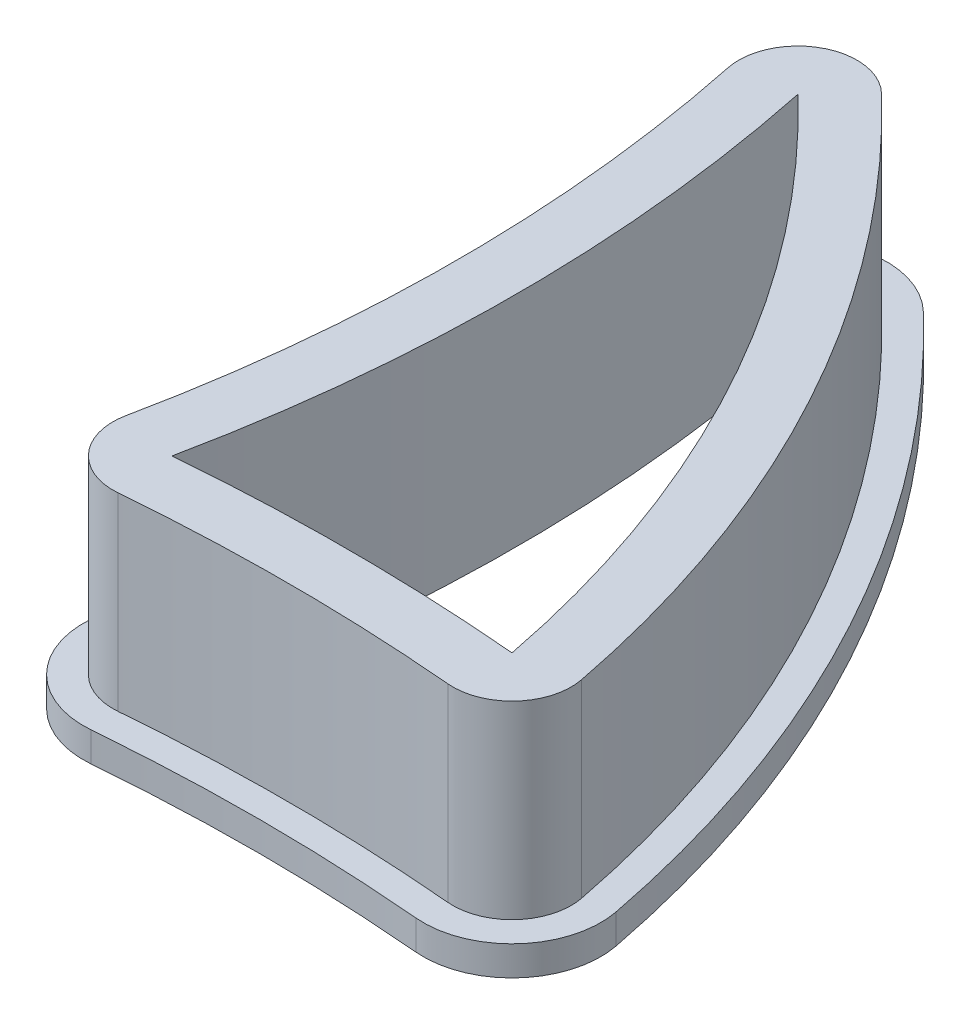
ISO-10303-21;
HEADER;
FILE_DESCRIPTION(('STEP AP214'),'2;1');
FILE_NAME('part.step','',(''),(''),'','','');
FILE_SCHEMA(('AUTOMOTIVE_DESIGN { 1 0 10303 214 1 1 1 1 }'));
ENDSEC;
DATA;
#1=APPLICATION_CONTEXT('core data for automotive mechanical design processes');
#2=APPLICATION_PROTOCOL_DEFINITION('international standard','automotive_design',2000,#1);
#3=PRODUCT_CONTEXT('',#1,'mechanical');
#4=PRODUCT('Part','Part','',(#3));
#5=PRODUCT_RELATED_PRODUCT_CATEGORY('part','',(#4));
#6=PRODUCT_DEFINITION_FORMATION('','',#4);
#7=PRODUCT_DEFINITION_CONTEXT('part definition',#1,'design');
#8=PRODUCT_DEFINITION('design','',#6,#7);
#9=PRODUCT_DEFINITION_SHAPE('','',#8);
#10=(LENGTH_UNIT() NAMED_UNIT(*) SI_UNIT(.MILLI.,.METRE.));
#11=(NAMED_UNIT(*) PLANE_ANGLE_UNIT() SI_UNIT($,.RADIAN.));
#12=(NAMED_UNIT(*) SI_UNIT($,.STERADIAN.) SOLID_ANGLE_UNIT());
#13=UNCERTAINTY_MEASURE_WITH_UNIT(LENGTH_MEASURE(1.E-05),#10,'distance_accuracy_value','');
#14=(GEOMETRIC_REPRESENTATION_CONTEXT(3) GLOBAL_UNCERTAINTY_ASSIGNED_CONTEXT((#13)) GLOBAL_UNIT_ASSIGNED_CONTEXT((#10,
#11,#12)) REPRESENTATION_CONTEXT('',''));
#15=CARTESIAN_POINT('',(0.,0.,0.));
#16=DIRECTION('',(0.,0.,1.));
#17=DIRECTION('',(1.,0.,0.));
#18=AXIS2_PLACEMENT_3D('',#15,#16,#17);
#19=CARTESIAN_POINT('',(-16.7034426225577,6.4,28.0001131602208));
#20=DIRECTION('',(0.,-1.,0.));
#21=DIRECTION('',(0.,0.,-1.));
#22=AXIS2_PLACEMENT_3D('',#19,#20,#21);
#23=PLANE('',#22);
#24=CARTESIAN_POINT('',(-56.570297770506,6.4,-19.7668709331461));
#25=DIRECTION('',(0.,-1.,0.));
#26=DIRECTION('',(0.,0.,-1.));
#27=AXIS2_PLACEMENT_3D('',#24,#25,#26);
#28=CIRCLE('',#27,50.);
#29=CARTESIAN_POINT('',(-7.6214221967614,6.4,-29.9652815968757));
#30=VERTEX_POINT('',#29);
#31=CARTESIAN_POINT('',(-7.61303510442141,6.4,-9.60879866307428));
#32=VERTEX_POINT('',#31);
#33=EDGE_CURVE('E245',#30,#32,#28,.T.);
#34=ORIENTED_EDGE('',*,*,#33,.T.);
#35=CARTESIAN_POINT('',(-5.65474459777802,6.4,-9.20247577227141));
#36=DIRECTION('',(0.,-1.,0.));
#37=DIRECTION('',(0.,0.,-1.));
#38=AXIS2_PLACEMENT_3D('',#35,#36,#37);
#39=CIRCLE('',#38,2.);
#40=CARTESIAN_POINT('',(-5.48594625157569,6.4,-7.20961172314027));
#41=VERTEX_POINT('',#40);
#42=EDGE_CURVE('E277',#32,#41,#39,.F.);
#43=ORIENTED_EDGE('',*,*,#42,.T.);
#44=CARTESIAN_POINT('',(0.,6.4,57.5584698736217));
#45=DIRECTION('',(0.,-1.,0.));
#46=DIRECTION('',(0.,0.,-1.));
#47=AXIS2_PLACEMENT_3D('',#44,#45,#46);
#48=CIRCLE('',#47,65.);
#49=CARTESIAN_POINT('',(5.68441833818465,6.4,-7.19249450650553));
#50=VERTEX_POINT('',#49);
#51=EDGE_CURVE('E231',#41,#50,#48,.T.);
#52=ORIENTED_EDGE('',*,*,#51,.T.);
#53=CARTESIAN_POINT('',(5.8593235178211,6.4,-9.18483187204791));
#54=DIRECTION('',(0.,-1.,0.));
#55=DIRECTION('',(0.,0.,-1.));
#56=AXIS2_PLACEMENT_3D('',#53,#54,#55);
#57=CIRCLE('',#56,2.);
#58=CARTESIAN_POINT('',(7.82263395596792,6.4,-9.5661612879913));
#59=VERTEX_POINT('',#58);
#60=EDGE_CURVE('E271',#50,#59,#57,.F.);
#61=ORIENTED_EDGE('',*,*,#60,.T.);
#62=CARTESIAN_POINT('',(-33.4068852451154,6.4,-1.55824355318018));
#63=DIRECTION('',(0.,1.,0.));
#64=DIRECTION('',(0.,0.,1.));
#65=AXIS2_PLACEMENT_3D('',#62,#63,#64);
#66=CIRCLE('',#65,42.);
#67=CARTESIAN_POINT('',(-4.27629627024642,6.4,-31.8139667469371));
#68=VERTEX_POINT('',#67);
#69=EDGE_CURVE('E240',#59,#68,#66,.T.);
#70=ORIENTED_EDGE('',*,*,#69,.T.);
#71=CARTESIAN_POINT('',(-5.66346717381161,6.4,-30.3732180234249));
#72=DIRECTION('',(0.,-1.,0.));
#73=DIRECTION('',(0.,0.,-1.));
#74=AXIS2_PLACEMENT_3D('',#71,#72,#73);
#75=CIRCLE('',#74,2.);
#76=EDGE_CURVE('E268',#68,#30,#75,.F.);
#77=ORIENTED_EDGE('',*,*,#76,.T.);
#78=EDGE_LOOP('',(#34,#43,#52,#61,#70,#77));
#79=FACE_BOUND('',#78,.T.);
#80=CARTESIAN_POINT('',(0.,6.4,57.5584698736217));
#81=DIRECTION('',(0.,-1.,0.));
#82=DIRECTION('',(0.,0.,-1.));
#83=AXIS2_PLACEMENT_3D('',#80,#81,#82);
#84=CIRCLE('',#83,67.);
#85=CARTESIAN_POINT('',(-5.65474459777802,6.4,-9.20247577227142));
#86=VERTEX_POINT('',#85);
#87=CARTESIAN_POINT('',(5.8593235178211,6.4,-9.1848318720479));
#88=VERTEX_POINT('',#87);
#89=EDGE_CURVE('E177',#86,#88,#84,.T.);
#90=ORIENTED_EDGE('',*,*,#89,.F.);
#91=CARTESIAN_POINT('',(-56.570297770506,6.4,-19.7668709331461));
#92=DIRECTION('',(0.,-1.,0.));
#93=DIRECTION('',(0.,0.,-1.));
#94=AXIS2_PLACEMENT_3D('',#91,#92,#93);
#95=CIRCLE('',#94,52.);
#96=CARTESIAN_POINT('',(-5.66346717381161,6.4,-30.3732180234249));
#97=VERTEX_POINT('',#96);
#98=EDGE_CURVE('E223',#97,#86,#95,.T.);
#99=ORIENTED_EDGE('',*,*,#98,.F.);
#100=CARTESIAN_POINT('',(-33.4068852451154,6.4,-1.55824355318018));
#101=DIRECTION('',(0.,1.,0.));
#102=DIRECTION('',(0.,0.,1.));
#103=AXIS2_PLACEMENT_3D('',#100,#101,#102);
#104=CIRCLE('',#103,40.);
#105=EDGE_CURVE('E225',#88,#97,#104,.T.);
#106=ORIENTED_EDGE('',*,*,#105,.F.);
#107=EDGE_LOOP('',(#90,#99,#106));
#108=FACE_BOUND('',#107,.T.);
#109=ADVANCED_FACE('F65',(#79,#108),#23,.F.);
#110=CARTESIAN_POINT('',(0.,6.4,57.5584698736217));
#111=DIRECTION('',(0.,-1.,0.));
#112=DIRECTION('',(0.,0.,-1.));
#113=AXIS2_PLACEMENT_3D('',#110,#111,#112);
#114=CYLINDRICAL_SURFACE('',#113,65.);
#115=ORIENTED_EDGE('',*,*,#51,.F.);
#116=DIRECTION('',(0.,-1.,0.));
#117=VECTOR('',#116,1.);
#118=CARTESIAN_POINT('',(-5.48594625157569,6.4,-7.20961172314029));
#119=LINE('',#118,#117);
#120=CARTESIAN_POINT('',(-5.48594625157569,0.,-7.20961172314027));
#121=VERTEX_POINT('',#120);
#122=EDGE_CURVE('E256',#41,#121,#119,.T.);
#123=ORIENTED_EDGE('',*,*,#122,.T.);
#124=CARTESIAN_POINT('',(0.,0.,57.5584698736217));
#125=DIRECTION('',(0.,-1.,0.));
#126=DIRECTION('',(0.,0.,-1.));
#127=AXIS2_PLACEMENT_3D('',#124,#125,#126);
#128=CIRCLE('',#127,65.);
#129=CARTESIAN_POINT('',(5.68441833818465,0.,-7.19249450650553));
#130=VERTEX_POINT('',#129);
#131=EDGE_CURVE('E185',#121,#130,#128,.T.);
#132=ORIENTED_EDGE('',*,*,#131,.T.);
#133=DIRECTION('',(0.,-1.,0.));
#134=VECTOR('',#133,1.);
#135=CARTESIAN_POINT('',(5.68441833818465,6.4,-7.19249450650553));
#136=LINE('',#135,#134);
#137=EDGE_CURVE('E246',#130,#50,#136,.F.);
#138=ORIENTED_EDGE('',*,*,#137,.T.);
#139=EDGE_LOOP('',(#115,#123,#132,#138));
#140=FACE_BOUND('',#139,.T.);
#141=ADVANCED_FACE('F356',(#140),#114,.F.);
#142=CARTESIAN_POINT('',(-33.4068852451154,6.4,-1.55824355318018));
#143=DIRECTION('',(0.,-1.,0.));
#144=DIRECTION('',(0.,0.,-1.));
#145=AXIS2_PLACEMENT_3D('',#142,#143,#144);
#146=CYLINDRICAL_SURFACE('',#145,42.);
#147=ORIENTED_EDGE('',*,*,#69,.F.);
#148=DIRECTION('',(0.,-1.,0.));
#149=VECTOR('',#148,1.);
#150=CARTESIAN_POINT('',(7.82263395596792,6.4,-9.5661612879913));
#151=LINE('',#150,#149);
#152=CARTESIAN_POINT('',(7.82263395596792,0.,-9.5661612879913));
#153=VERTEX_POINT('',#152);
#154=EDGE_CURVE('E285',#59,#153,#151,.T.);
#155=ORIENTED_EDGE('',*,*,#154,.T.);
#156=CARTESIAN_POINT('',(-33.4068852451154,0.,-1.55824355318018));
#157=DIRECTION('',(0.,1.,0.));
#158=DIRECTION('',(0.,0.,1.));
#159=AXIS2_PLACEMENT_3D('',#156,#157,#158);
#160=CIRCLE('',#159,42.);
#161=CARTESIAN_POINT('',(-4.27629627024642,0.,-31.8139667469371));
#162=VERTEX_POINT('',#161);
#163=EDGE_CURVE('E249',#153,#162,#160,.T.);
#164=ORIENTED_EDGE('',*,*,#163,.T.);
#165=DIRECTION('',(0.,-1.,0.));
#166=VECTOR('',#165,1.);
#167=CARTESIAN_POINT('',(-4.27629627024642,6.4,-31.8139667469371));
#168=LINE('',#167,#166);
#169=EDGE_CURVE('E276',#162,#68,#168,.F.);
#170=ORIENTED_EDGE('',*,*,#169,.T.);
#171=EDGE_LOOP('',(#147,#155,#164,#170));
#172=FACE_BOUND('',#171,.T.);
#173=ADVANCED_FACE('F364',(#172),#146,.T.);
#174=CARTESIAN_POINT('',(-56.570297770506,6.4,-19.7668709331461));
#175=DIRECTION('',(0.,-1.,0.));
#176=DIRECTION('',(0.,0.,-1.));
#177=AXIS2_PLACEMENT_3D('',#174,#175,#176);
#178=CYLINDRICAL_SURFACE('',#177,50.);
#179=CARTESIAN_POINT('',(-56.570297770506,0.,-19.7668709331461));
#180=DIRECTION('',(0.,-1.,0.));
#181=DIRECTION('',(0.,0.,-1.));
#182=AXIS2_PLACEMENT_3D('',#179,#180,#181);
#183=CIRCLE('',#182,50.);
#184=CARTESIAN_POINT('',(-7.6214221967614,0.,-29.9652815968757));
#185=VERTEX_POINT('',#184);
#186=CARTESIAN_POINT('',(-7.61303510442141,0.,-9.60879866307428));
#187=VERTEX_POINT('',#186);
#188=EDGE_CURVE('E238',#185,#187,#183,.T.);
#189=ORIENTED_EDGE('',*,*,#188,.T.);
#190=DIRECTION('',(0.,-1.,0.));
#191=VECTOR('',#190,1.);
#192=CARTESIAN_POINT('',(-7.61303510442139,6.4,-9.60879866307428));
#193=LINE('',#192,#191);
#194=EDGE_CURVE('E270',#187,#32,#193,.F.);
#195=ORIENTED_EDGE('',*,*,#194,.T.);
#196=ORIENTED_EDGE('',*,*,#33,.F.);
#197=DIRECTION('',(0.,-1.,0.));
#198=VECTOR('',#197,1.);
#199=CARTESIAN_POINT('',(-7.62142219676139,6.4,-29.9652815968757));
#200=LINE('',#199,#198);
#201=EDGE_CURVE('E264',#30,#185,#200,.T.);
#202=ORIENTED_EDGE('',*,*,#201,.T.);
#203=EDGE_LOOP('',(#189,#195,#196,#202));
#204=FACE_BOUND('',#203,.T.);
#205=ADVANCED_FACE('F371',(#204),#178,.F.);
#206=CARTESIAN_POINT('',(0.,6.4,57.5584698736217));
#207=DIRECTION('',(0.,-1.,0.));
#208=DIRECTION('',(0.,0.,-1.));
#209=AXIS2_PLACEMENT_3D('',#206,#207,#208);
#210=CYLINDRICAL_SURFACE('',#209,67.);
#211=DIRECTION('',(0.,-1.,0.));
#212=VECTOR('',#211,1.);
#213=CARTESIAN_POINT('',(5.8593235178211,6.4,-9.1848318720479));
#214=LINE('',#213,#212);
#215=CARTESIAN_POINT('',(5.85932351782112,-1.,-9.1848318720479));
#216=VERTEX_POINT('',#215);
#217=EDGE_CURVE('E175',#88,#216,#214,.T.);
#218=ORIENTED_EDGE('',*,*,#217,.T.);
#219=CARTESIAN_POINT('',(0.,-1.,57.5584698736217));
#220=DIRECTION('',(0.,1.,0.));
#221=DIRECTION('',(0.,0.,1.));
#222=AXIS2_PLACEMENT_3D('',#219,#220,#221);
#223=CIRCLE('',#222,67.);
#224=CARTESIAN_POINT('',(-5.65474459777802,-1.,-9.20247577227142));
#225=VERTEX_POINT('',#224);
#226=EDGE_CURVE('E176',#225,#216,#223,.F.);
#227=ORIENTED_EDGE('',*,*,#226,.F.);
#228=DIRECTION('',(0.,-1.,0.));
#229=VECTOR('',#228,1.);
#230=CARTESIAN_POINT('',(-5.65474459777802,6.4,-9.20247577227142));
#231=LINE('',#230,#229);
#232=EDGE_CURVE('E226',#86,#225,#231,.T.);
#233=ORIENTED_EDGE('',*,*,#232,.F.);
#234=ORIENTED_EDGE('',*,*,#89,.T.);
#235=EDGE_LOOP('',(#218,#227,#233,#234));
#236=FACE_BOUND('',#235,.T.);
#237=ADVANCED_FACE('F173',(#236),#210,.T.);
#238=CARTESIAN_POINT('',(-33.4068852451154,6.4,-1.55824355318018));
#239=DIRECTION('',(0.,-1.,0.));
#240=DIRECTION('',(0.,0.,-1.));
#241=AXIS2_PLACEMENT_3D('',#238,#239,#240);
#242=CYLINDRICAL_SURFACE('',#241,40.);
#243=DIRECTION('',(0.,-1.,0.));
#244=VECTOR('',#243,1.);
#245=CARTESIAN_POINT('',(-5.66346717381161,6.4,-30.3732180234249));
#246=LINE('',#245,#244);
#247=CARTESIAN_POINT('',(-5.66346717381161,-1.,-30.3732180234249));
#248=VERTEX_POINT('',#247);
#249=EDGE_CURVE('E76',#97,#248,#246,.T.);
#250=ORIENTED_EDGE('',*,*,#249,.T.);
#251=CARTESIAN_POINT('',(-33.4068852451154,-1.,-1.55824355318018));
#252=DIRECTION('',(0.,1.,0.));
#253=DIRECTION('',(0.,0.,1.));
#254=AXIS2_PLACEMENT_3D('',#251,#252,#253);
#255=CIRCLE('',#254,40.);
#256=EDGE_CURVE('E184',#216,#248,#255,.T.);
#257=ORIENTED_EDGE('',*,*,#256,.F.);
#258=ORIENTED_EDGE('',*,*,#217,.F.);
#259=ORIENTED_EDGE('',*,*,#105,.T.);
#260=EDGE_LOOP('',(#250,#257,#258,#259));
#261=FACE_BOUND('',#260,.T.);
#262=ADVANCED_FACE('F187',(#261),#242,.F.);
#263=CARTESIAN_POINT('',(-56.570297770506,6.4,-19.7668709331461));
#264=DIRECTION('',(0.,-1.,0.));
#265=DIRECTION('',(0.,0.,-1.));
#266=AXIS2_PLACEMENT_3D('',#263,#264,#265);
#267=CYLINDRICAL_SURFACE('',#266,52.);
#268=ORIENTED_EDGE('',*,*,#232,.T.);
#269=CARTESIAN_POINT('',(-56.570297770506,-1.,-19.7668709331461));
#270=DIRECTION('',(0.,1.,0.));
#271=DIRECTION('',(0.,0.,1.));
#272=AXIS2_PLACEMENT_3D('',#269,#270,#271);
#273=CIRCLE('',#272,52.);
#274=EDGE_CURVE('E186',#248,#225,#273,.F.);
#275=ORIENTED_EDGE('',*,*,#274,.F.);
#276=ORIENTED_EDGE('',*,*,#249,.F.);
#277=ORIENTED_EDGE('',*,*,#98,.T.);
#278=EDGE_LOOP('',(#268,#275,#276,#277));
#279=FACE_BOUND('',#278,.T.);
#280=ADVANCED_FACE('F428',(#279),#267,.T.);
#281=CARTESIAN_POINT('',(0.,-1.,57.5584698736217));
#282=DIRECTION('',(0.,1.,0.));
#283=DIRECTION('',(0.,0.,1.));
#284=AXIS2_PLACEMENT_3D('',#281,#282,#283);
#285=CYLINDRICAL_SURFACE('',#284,64.);
#286=CARTESIAN_POINT('',(0.,0.,57.5584698736217));
#287=DIRECTION('',(0.,-1.,0.));
#288=DIRECTION('',(0.,0.,-1.));
#289=AXIS2_PLACEMENT_3D('',#286,#287,#288);
#290=CIRCLE('',#289,64.);
#291=CARTESIAN_POINT('',(-5.40154707847453,0.,-6.2131796985747));
#292=VERTEX_POINT('',#291);
#293=CARTESIAN_POINT('',(5.59696574836643,0.,-6.19632582373433));
#294=VERTEX_POINT('',#293);
#295=EDGE_CURVE('E200',#292,#294,#290,.T.);
#296=ORIENTED_EDGE('',*,*,#295,.F.);
#297=DIRECTION('',(0.,1.,0.));
#298=VECTOR('',#297,1.);
#299=CARTESIAN_POINT('',(-5.40154707847454,-1.,-6.21317969857471));
#300=LINE('',#299,#298);
#301=CARTESIAN_POINT('',(-5.40154707847453,-1.,-6.2131796985747));
#302=VERTEX_POINT('',#301);
#303=EDGE_CURVE('E314',#292,#302,#300,.F.);
#304=ORIENTED_EDGE('',*,*,#303,.T.);
#305=CARTESIAN_POINT('',(0.,-1.,57.5584698736217));
#306=DIRECTION('',(0.,-1.,0.));
#307=DIRECTION('',(0.,0.,-1.));
#308=AXIS2_PLACEMENT_3D('',#305,#306,#307);
#309=CIRCLE('',#308,64.);
#310=CARTESIAN_POINT('',(5.59696574836643,-1.,-6.19632582373433));
#311=VERTEX_POINT('',#310);
#312=EDGE_CURVE('E199',#302,#311,#309,.T.);
#313=ORIENTED_EDGE('',*,*,#312,.T.);
#314=DIRECTION('',(0.,1.,0.));
#315=VECTOR('',#314,1.);
#316=CARTESIAN_POINT('',(5.59696574836643,-1.,-6.19632582373433));
#317=LINE('',#316,#315);
#318=EDGE_CURVE('E311',#311,#294,#317,.T.);
#319=ORIENTED_EDGE('',*,*,#318,.T.);
#320=EDGE_LOOP('',(#296,#304,#313,#319));
#321=FACE_BOUND('',#320,.T.);
#322=ADVANCED_FACE('F345',(#321),#285,.F.);
#323=CARTESIAN_POINT('',(-56.570297770506,-1.,-19.7668709331461));
#324=DIRECTION('',(0.,1.,0.));
#325=DIRECTION('',(0.,0.,1.));
#326=AXIS2_PLACEMENT_3D('',#323,#324,#325);
#327=CYLINDRICAL_SURFACE('',#326,49.);
#328=CARTESIAN_POINT('',(-56.570297770506,-1.,-19.7668709331461));
#329=DIRECTION('',(0.,-1.,0.));
#330=DIRECTION('',(0.,0.,-1.));
#331=AXIS2_PLACEMENT_3D('',#328,#329,#330);
#332=CIRCLE('',#331,49.);
#333=CARTESIAN_POINT('',(-8.60039970823628,-1.,-29.7613133836011));
#334=VERTEX_POINT('',#333);
#335=CARTESIAN_POINT('',(-8.5921803577431,-1.,-9.81196010847571));
#336=VERTEX_POINT('',#335);
#337=EDGE_CURVE('E207',#334,#336,#332,.T.);
#338=ORIENTED_EDGE('',*,*,#337,.T.);
#339=DIRECTION('',(0.,1.,0.));
#340=VECTOR('',#339,1.);
#341=CARTESIAN_POINT('',(-8.59218035774308,-1.,-9.81196010847571));
#342=LINE('',#341,#340);
#343=CARTESIAN_POINT('',(-8.5921803577431,0.,-9.81196010847571));
#344=VERTEX_POINT('',#343);
#345=EDGE_CURVE('E296',#336,#344,#342,.T.);
#346=ORIENTED_EDGE('',*,*,#345,.T.);
#347=CARTESIAN_POINT('',(-56.570297770506,0.,-19.7668709331461));
#348=DIRECTION('',(0.,-1.,0.));
#349=DIRECTION('',(0.,0.,-1.));
#350=AXIS2_PLACEMENT_3D('',#347,#348,#349);
#351=CIRCLE('',#350,49.);
#352=CARTESIAN_POINT('',(-8.60039970823628,0.,-29.7613133836011));
#353=VERTEX_POINT('',#352);
#354=EDGE_CURVE('E204',#353,#344,#351,.T.);
#355=ORIENTED_EDGE('',*,*,#354,.F.);
#356=DIRECTION('',(0.,1.,0.));
#357=VECTOR('',#356,1.);
#358=CARTESIAN_POINT('',(-8.60039970823628,-1.,-29.7613133836011));
#359=LINE('',#358,#357);
#360=EDGE_CURVE('E294',#353,#334,#359,.F.);
#361=ORIENTED_EDGE('',*,*,#360,.T.);
#362=EDGE_LOOP('',(#338,#346,#355,#361));
#363=FACE_BOUND('',#362,.T.);
#364=ADVANCED_FACE('F348',(#363),#327,.F.);
#365=CARTESIAN_POINT('',(-33.4068852451154,-1.,-1.55824355318018));
#366=DIRECTION('',(0.,1.,0.));
#367=DIRECTION('',(0.,0.,1.));
#368=AXIS2_PLACEMENT_3D('',#365,#366,#367);
#369=CYLINDRICAL_SURFACE('',#368,43.);
#370=CARTESIAN_POINT('',(-33.4068852451154,0.,-1.55824355318018));
#371=DIRECTION('',(0.,1.,0.));
#372=DIRECTION('',(0.,0.,1.));
#373=AXIS2_PLACEMENT_3D('',#370,#371,#372);
#374=CIRCLE('',#373,43.);
#375=CARTESIAN_POINT('',(8.80428917504134,0.,-9.75682599596299));
#376=VERTEX_POINT('',#375);
#377=CARTESIAN_POINT('',(-3.58271081846382,0.,-32.5343411086932));
#378=VERTEX_POINT('',#377);
#379=EDGE_CURVE('E214',#376,#378,#374,.T.);
#380=ORIENTED_EDGE('',*,*,#379,.F.);
#381=DIRECTION('',(0.,1.,0.));
#382=VECTOR('',#381,1.);
#383=CARTESIAN_POINT('',(8.80428917504134,-1.,-9.75682599596299));
#384=LINE('',#383,#382);
#385=CARTESIAN_POINT('',(8.80428917504134,-1.,-9.75682599596299));
#386=VERTEX_POINT('',#385);
#387=EDGE_CURVE('E12',#376,#386,#384,.F.);
#388=ORIENTED_EDGE('',*,*,#387,.T.);
#389=CARTESIAN_POINT('',(-33.4068852451154,-1.,-1.55824355318018));
#390=DIRECTION('',(0.,1.,0.));
#391=DIRECTION('',(0.,0.,1.));
#392=AXIS2_PLACEMENT_3D('',#389,#390,#391);
#393=CIRCLE('',#392,43.);
#394=CARTESIAN_POINT('',(-3.58271081846382,-1.,-32.5343411086932));
#395=VERTEX_POINT('',#394);
#396=EDGE_CURVE('E205',#386,#395,#393,.T.);
#397=ORIENTED_EDGE('',*,*,#396,.T.);
#398=DIRECTION('',(0.,1.,0.));
#399=VECTOR('',#398,1.);
#400=CARTESIAN_POINT('',(-3.58271081846382,-1.,-32.5343411086932));
#401=LINE('',#400,#399);
#402=EDGE_CURVE('E72',#395,#378,#401,.T.);
#403=ORIENTED_EDGE('',*,*,#402,.T.);
#404=EDGE_LOOP('',(#380,#388,#397,#403));
#405=FACE_BOUND('',#404,.T.);
#406=ADVANCED_FACE('F328',(#405),#369,.T.);
#407=CARTESIAN_POINT('',(-16.7034426225577,-1.,28.0001131602208));
#408=DIRECTION('',(0.,-1.,0.));
#409=DIRECTION('',(0.,0.,-1.));
#410=AXIS2_PLACEMENT_3D('',#407,#408,#409);
#411=PLANE('',#410);
#412=ORIENTED_EDGE('',*,*,#226,.T.);
#413=ORIENTED_EDGE('',*,*,#256,.T.);
#414=ORIENTED_EDGE('',*,*,#274,.T.);
#415=EDGE_LOOP('',(#412,#413,#414));
#416=FACE_BOUND('',#415,.T.);
#417=ORIENTED_EDGE('',*,*,#312,.F.);
#418=CARTESIAN_POINT('',(-5.65474459777803,-1.,-9.2024757722714));
#419=DIRECTION('',(0.,-1.,0.));
#420=DIRECTION('',(0.,0.,-1.));
#421=AXIS2_PLACEMENT_3D('',#418,#419,#420);
#422=CIRCLE('',#421,3.);
#423=EDGE_CURVE('E324',#302,#336,#422,.T.);
#424=ORIENTED_EDGE('',*,*,#423,.T.);
#425=ORIENTED_EDGE('',*,*,#337,.F.);
#426=CARTESIAN_POINT('',(-5.66346717381161,-1.,-30.3732180234249));
#427=DIRECTION('',(0.,-1.,0.));
#428=DIRECTION('',(0.,0.,-1.));
#429=AXIS2_PLACEMENT_3D('',#426,#427,#428);
#430=CIRCLE('',#429,3.);
#431=EDGE_CURVE('E87',#334,#395,#430,.T.);
#432=ORIENTED_EDGE('',*,*,#431,.T.);
#433=ORIENTED_EDGE('',*,*,#396,.F.);
#434=CARTESIAN_POINT('',(5.85932351782111,-1.,-9.18483187204791));
#435=DIRECTION('',(0.,-1.,0.));
#436=DIRECTION('',(0.,0.,-1.));
#437=AXIS2_PLACEMENT_3D('',#434,#435,#436);
#438=CIRCLE('',#437,3.);
#439=EDGE_CURVE('E318',#386,#311,#438,.T.);
#440=ORIENTED_EDGE('',*,*,#439,.T.);
#441=EDGE_LOOP('',(#417,#424,#425,#432,#433,#440));
#442=FACE_BOUND('',#441,.T.);
#443=ADVANCED_FACE('F192',(#416,#442),#411,.T.);
#444=CARTESIAN_POINT('',(-16.7034426225577,0.,28.0001131602208));
#445=DIRECTION('',(0.,-1.,0.));
#446=DIRECTION('',(0.,0.,-1.));
#447=AXIS2_PLACEMENT_3D('',#444,#445,#446);
#448=PLANE('',#447);
#449=ORIENTED_EDGE('',*,*,#131,.F.);
#450=CARTESIAN_POINT('',(-5.65474459777802,0.,-9.20247577227141));
#451=DIRECTION('',(0.,-1.,0.));
#452=DIRECTION('',(0.,0.,-1.));
#453=AXIS2_PLACEMENT_3D('',#450,#451,#452);
#454=CIRCLE('',#453,2.);
#455=EDGE_CURVE('E287',#121,#187,#454,.T.);
#456=ORIENTED_EDGE('',*,*,#455,.T.);
#457=ORIENTED_EDGE('',*,*,#188,.F.);
#458=CARTESIAN_POINT('',(-5.66346717381161,0.,-30.3732180234249));
#459=DIRECTION('',(0.,-1.,0.));
#460=DIRECTION('',(0.,0.,-1.));
#461=AXIS2_PLACEMENT_3D('',#458,#459,#460);
#462=CIRCLE('',#461,2.);
#463=EDGE_CURVE('E292',#185,#162,#462,.T.);
#464=ORIENTED_EDGE('',*,*,#463,.T.);
#465=ORIENTED_EDGE('',*,*,#163,.F.);
#466=CARTESIAN_POINT('',(5.8593235178211,0.,-9.18483187204791));
#467=DIRECTION('',(0.,-1.,0.));
#468=DIRECTION('',(0.,0.,-1.));
#469=AXIS2_PLACEMENT_3D('',#466,#467,#468);
#470=CIRCLE('',#469,2.);
#471=EDGE_CURVE('E286',#153,#130,#470,.T.);
#472=ORIENTED_EDGE('',*,*,#471,.T.);
#473=EDGE_LOOP('',(#449,#456,#457,#464,#465,#472));
#474=FACE_BOUND('',#473,.T.);
#475=ORIENTED_EDGE('',*,*,#354,.T.);
#476=CARTESIAN_POINT('',(-5.65474459777803,0.,-9.2024757722714));
#477=DIRECTION('',(0.,-1.,0.));
#478=DIRECTION('',(0.,0.,-1.));
#479=AXIS2_PLACEMENT_3D('',#476,#477,#478);
#480=CIRCLE('',#479,3.);
#481=EDGE_CURVE('E308',#344,#292,#480,.F.);
#482=ORIENTED_EDGE('',*,*,#481,.T.);
#483=ORIENTED_EDGE('',*,*,#295,.T.);
#484=CARTESIAN_POINT('',(5.85932351782111,0.,-9.18483187204791));
#485=DIRECTION('',(0.,-1.,0.));
#486=DIRECTION('',(0.,0.,-1.));
#487=AXIS2_PLACEMENT_3D('',#484,#485,#486);
#488=CIRCLE('',#487,3.);
#489=EDGE_CURVE('E304',#294,#376,#488,.F.);
#490=ORIENTED_EDGE('',*,*,#489,.T.);
#491=ORIENTED_EDGE('',*,*,#379,.T.);
#492=CARTESIAN_POINT('',(-5.66346717381161,0.,-30.3732180234249));
#493=DIRECTION('',(0.,-1.,0.));
#494=DIRECTION('',(0.,0.,-1.));
#495=AXIS2_PLACEMENT_3D('',#492,#493,#494);
#496=CIRCLE('',#495,3.);
#497=EDGE_CURVE('E305',#378,#353,#496,.F.);
#498=ORIENTED_EDGE('',*,*,#497,.T.);
#499=EDGE_LOOP('',(#475,#482,#483,#490,#491,#498));
#500=FACE_BOUND('',#499,.T.);
#501=ADVANCED_FACE('F331',(#474,#500),#448,.F.);
#502=CARTESIAN_POINT('',(-5.65474459777802,6.4,-9.20247577227141));
#503=DIRECTION('',(0.,-1.,0.));
#504=DIRECTION('',(0.,0.,-1.));
#505=AXIS2_PLACEMENT_3D('',#502,#503,#504);
#506=CYLINDRICAL_SURFACE('',#505,2.);
#507=ORIENTED_EDGE('',*,*,#42,.F.);
#508=ORIENTED_EDGE('',*,*,#194,.F.);
#509=ORIENTED_EDGE('',*,*,#455,.F.);
#510=ORIENTED_EDGE('',*,*,#122,.F.);
#511=EDGE_LOOP('',(#507,#508,#509,#510));
#512=FACE_BOUND('',#511,.T.);
#513=ADVANCED_FACE('F377',(#512),#506,.T.);
#514=CARTESIAN_POINT('',(5.8593235178211,6.4,-9.18483187204791));
#515=DIRECTION('',(0.,1.,0.));
#516=DIRECTION('',(0.,0.,1.));
#517=AXIS2_PLACEMENT_3D('',#514,#515,#516);
#518=CYLINDRICAL_SURFACE('',#517,2.);
#519=ORIENTED_EDGE('',*,*,#60,.F.);
#520=ORIENTED_EDGE('',*,*,#137,.F.);
#521=ORIENTED_EDGE('',*,*,#471,.F.);
#522=ORIENTED_EDGE('',*,*,#154,.F.);
#523=EDGE_LOOP('',(#519,#520,#521,#522));
#524=FACE_BOUND('',#523,.T.);
#525=ADVANCED_FACE('F382',(#524),#518,.T.);
#526=CARTESIAN_POINT('',(-5.66346717381161,6.4,-30.3732180234249));
#527=DIRECTION('',(0.,1.,0.));
#528=DIRECTION('',(0.,0.,1.));
#529=AXIS2_PLACEMENT_3D('',#526,#527,#528);
#530=CYLINDRICAL_SURFACE('',#529,2.);
#531=ORIENTED_EDGE('',*,*,#76,.F.);
#532=ORIENTED_EDGE('',*,*,#169,.F.);
#533=ORIENTED_EDGE('',*,*,#463,.F.);
#534=ORIENTED_EDGE('',*,*,#201,.F.);
#535=EDGE_LOOP('',(#531,#532,#533,#534));
#536=FACE_BOUND('',#535,.T.);
#537=ADVANCED_FACE('F383',(#536),#530,.T.);
#538=CARTESIAN_POINT('',(-5.65474459777803,-1.,-9.2024757722714));
#539=DIRECTION('',(0.,1.,0.));
#540=DIRECTION('',(0.,0.,1.));
#541=AXIS2_PLACEMENT_3D('',#538,#539,#540);
#542=CYLINDRICAL_SURFACE('',#541,3.);
#543=ORIENTED_EDGE('',*,*,#423,.F.);
#544=ORIENTED_EDGE('',*,*,#303,.F.);
#545=ORIENTED_EDGE('',*,*,#481,.F.);
#546=ORIENTED_EDGE('',*,*,#345,.F.);
#547=EDGE_LOOP('',(#543,#544,#545,#546));
#548=FACE_BOUND('',#547,.T.);
#549=ADVANCED_FACE('F349',(#548),#542,.T.);
#550=CARTESIAN_POINT('',(5.85932351782111,-1.,-9.18483187204791));
#551=DIRECTION('',(0.,-1.,0.));
#552=DIRECTION('',(0.,0.,-1.));
#553=AXIS2_PLACEMENT_3D('',#550,#551,#552);
#554=CYLINDRICAL_SURFACE('',#553,3.);
#555=ORIENTED_EDGE('',*,*,#439,.F.);
#556=ORIENTED_EDGE('',*,*,#387,.F.);
#557=ORIENTED_EDGE('',*,*,#489,.F.);
#558=ORIENTED_EDGE('',*,*,#318,.F.);
#559=EDGE_LOOP('',(#555,#556,#557,#558));
#560=FACE_BOUND('',#559,.T.);
#561=ADVANCED_FACE('F338',(#560),#554,.T.);
#562=CARTESIAN_POINT('',(-5.66346717381161,-1.,-30.3732180234249));
#563=DIRECTION('',(0.,-1.,0.));
#564=DIRECTION('',(0.,0.,-1.));
#565=AXIS2_PLACEMENT_3D('',#562,#563,#564);
#566=CYLINDRICAL_SURFACE('',#565,3.);
#567=ORIENTED_EDGE('',*,*,#431,.F.);
#568=ORIENTED_EDGE('',*,*,#360,.F.);
#569=ORIENTED_EDGE('',*,*,#497,.F.);
#570=ORIENTED_EDGE('',*,*,#402,.F.);
#571=EDGE_LOOP('',(#567,#568,#569,#570));
#572=FACE_BOUND('',#571,.T.);
#573=ADVANCED_FACE('F61',(#572),#566,.T.);
#574=CLOSED_SHELL('',(#109,#141,#173,#205,#237,#262,#280,#322,#364,#406,#443,#501,#513,#525,
#537,#549,#561,#573));
#575=MANIFOLD_SOLID_BREP('B2',#574);
#576=ADVANCED_BREP_SHAPE_REPRESENTATION('',(#18,#575),#14);
#577=SHAPE_DEFINITION_REPRESENTATION(#9,#576);
ENDSEC;
END-ISO-10303-21;
